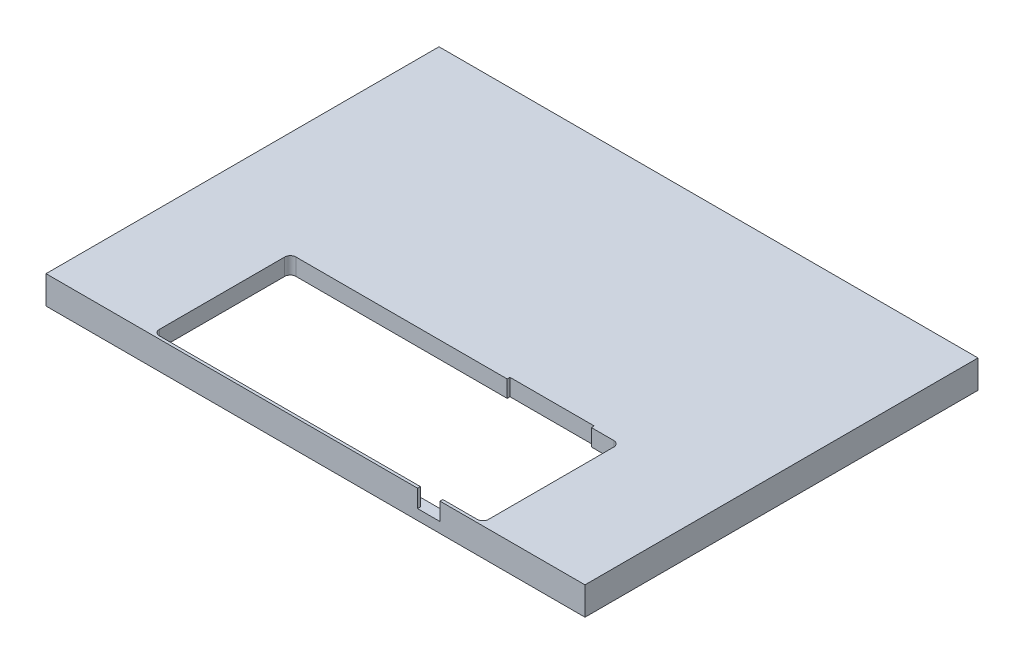
ISO-10303-21;
HEADER;
FILE_DESCRIPTION(('STEP AP214'),'2;1');
FILE_NAME('part.step','',(''),(''),'','','');
FILE_SCHEMA(('AUTOMOTIVE_DESIGN { 1 0 10303 214 1 1 1 1 }'));
ENDSEC;
DATA;
#1=APPLICATION_CONTEXT('core data for automotive mechanical design processes');
#2=APPLICATION_PROTOCOL_DEFINITION('international standard','automotive_design',2000,#1);
#3=PRODUCT_CONTEXT('',#1,'mechanical');
#4=PRODUCT('Part','Part','',(#3));
#5=PRODUCT_RELATED_PRODUCT_CATEGORY('part','',(#4));
#6=PRODUCT_DEFINITION_FORMATION('','',#4);
#7=PRODUCT_DEFINITION_CONTEXT('part definition',#1,'design');
#8=PRODUCT_DEFINITION('design','',#6,#7);
#9=PRODUCT_DEFINITION_SHAPE('','',#8);
#10=(LENGTH_UNIT() NAMED_UNIT(*) SI_UNIT(.MILLI.,.METRE.));
#11=(NAMED_UNIT(*) PLANE_ANGLE_UNIT() SI_UNIT($,.RADIAN.));
#12=(NAMED_UNIT(*) SI_UNIT($,.STERADIAN.) SOLID_ANGLE_UNIT());
#13=UNCERTAINTY_MEASURE_WITH_UNIT(LENGTH_MEASURE(1.E-05),#10,'distance_accuracy_value','');
#14=(GEOMETRIC_REPRESENTATION_CONTEXT(3) GLOBAL_UNCERTAINTY_ASSIGNED_CONTEXT((#13)) GLOBAL_UNIT_ASSIGNED_CONTEXT((#10,
#11,#12)) REPRESENTATION_CONTEXT('',''));
#15=CARTESIAN_POINT('',(0.,0.,0.));
#16=DIRECTION('',(0.,0.,1.));
#17=DIRECTION('',(1.,0.,0.));
#18=AXIS2_PLACEMENT_3D('',#15,#16,#17);
#19=CARTESIAN_POINT('',(5.08,12.7,-5.08));
#20=DIRECTION('',(0.,0.,-1.));
#21=DIRECTION('',(-1.,0.,0.));
#22=AXIS2_PLACEMENT_3D('',#19,#20,#21);
#23=PLANE('',#22);
#24=DIRECTION('',(1.,0.,0.));
#25=VECTOR('',#24,1.);
#26=CARTESIAN_POINT('',(5.08,5.08,-5.08));
#27=LINE('',#26,#25);
#28=CARTESIAN_POINT('',(5.08,5.08,-5.08));
#29=VERTEX_POINT('',#28);
#30=CARTESIAN_POINT('',(47.47,5.08,-5.08));
#31=VERTEX_POINT('',#30);
#32=EDGE_CURVE('E297',#29,#31,#27,.T.);
#33=ORIENTED_EDGE('',*,*,#32,.T.);
#34=DIRECTION('',(0.,-1.,0.));
#35=VECTOR('',#34,1.);
#36=CARTESIAN_POINT('',(47.47,12.7,-5.08));
#37=LINE('',#36,#35);
#38=CARTESIAN_POINT('',(47.47,4.7,-5.08));
#39=VERTEX_POINT('',#38);
#40=EDGE_CURVE('E284',#31,#39,#37,.T.);
#41=ORIENTED_EDGE('',*,*,#40,.T.);
#42=DIRECTION('',(-1.,0.,0.));
#43=VECTOR('',#42,1.);
#44=CARTESIAN_POINT('',(5.08,4.7,-5.08));
#45=LINE('',#44,#43);
#46=CARTESIAN_POINT('',(196.37,4.7,-5.08));
#47=VERTEX_POINT('',#46);
#48=EDGE_CURVE('E287',#47,#39,#45,.T.);
#49=ORIENTED_EDGE('',*,*,#48,.F.);
#50=DIRECTION('',(0.,1.,0.));
#51=VECTOR('',#50,1.);
#52=CARTESIAN_POINT('',(196.37,12.7,-5.08));
#53=LINE('',#52,#51);
#54=CARTESIAN_POINT('',(196.37,5.08,-5.08));
#55=VERTEX_POINT('',#54);
#56=EDGE_CURVE('E281',#47,#55,#53,.T.);
#57=ORIENTED_EDGE('',*,*,#56,.T.);
#58=CARTESIAN_POINT('',(238.76,5.08,-5.08));
#59=VERTEX_POINT('',#58);
#60=EDGE_CURVE('E296',#55,#59,#27,.T.);
#61=ORIENTED_EDGE('',*,*,#60,.T.);
#62=DIRECTION('',(0.,-1.,0.));
#63=VECTOR('',#62,1.);
#64=CARTESIAN_POINT('',(238.76,12.7,-5.08));
#65=LINE('',#64,#63);
#66=CARTESIAN_POINT('',(238.76,0.,-5.08));
#67=VERTEX_POINT('',#66);
#68=EDGE_CURVE('E319',#59,#67,#65,.T.);
#69=ORIENTED_EDGE('',*,*,#68,.T.);
#70=DIRECTION('',(1.,0.,0.));
#71=VECTOR('',#70,1.);
#72=CARTESIAN_POINT('',(5.08,0.,-5.08));
#73=LINE('',#72,#71);
#74=CARTESIAN_POINT('',(5.08,0.,-5.08));
#75=VERTEX_POINT('',#74);
#76=EDGE_CURVE('E306',#75,#67,#73,.T.);
#77=ORIENTED_EDGE('',*,*,#76,.F.);
#78=DIRECTION('',(0.,-1.,0.));
#79=VECTOR('',#78,1.);
#80=CARTESIAN_POINT('',(5.08,12.7,-5.08));
#81=LINE('',#80,#79);
#82=EDGE_CURVE('E321',#29,#75,#81,.T.);
#83=ORIENTED_EDGE('',*,*,#82,.F.);
#84=EDGE_LOOP('',(#33,#41,#49,#57,#61,#69,#77,#83));
#85=FACE_BOUND('',#84,.T.);
#86=ADVANCED_FACE('F33',(#85),#23,.T.);
#87=CARTESIAN_POINT('',(0.,5.08,0.));
#88=DIRECTION('',(0.,1.,0.));
#89=DIRECTION('',(0.,0.,1.));
#90=AXIS2_PLACEMENT_3D('',#87,#88,#89);
#91=PLANE('',#90);
#92=DIRECTION('',(0.,0.,-1.));
#93=VECTOR('',#92,1.);
#94=CARTESIAN_POINT('',(47.47,5.08,0.));
#95=LINE('',#94,#93);
#96=CARTESIAN_POINT('',(47.47,5.08,-60.53));
#97=VERTEX_POINT('',#96);
#98=EDGE_CURVE('E370',#31,#97,#95,.T.);
#99=ORIENTED_EDGE('',*,*,#98,.F.);
#100=ORIENTED_EDGE('',*,*,#32,.F.);
#101=DIRECTION('',(0.,0.,1.));
#102=VECTOR('',#101,1.);
#103=CARTESIAN_POINT('',(5.08,5.08,-172.72));
#104=LINE('',#103,#102);
#105=CARTESIAN_POINT('',(5.08,5.08,-172.72));
#106=VERTEX_POINT('',#105);
#107=EDGE_CURVE('E293',#106,#29,#104,.T.);
#108=ORIENTED_EDGE('',*,*,#107,.F.);
#109=DIRECTION('',(-1.,0.,0.));
#110=VECTOR('',#109,1.);
#111=CARTESIAN_POINT('',(238.76,5.08,-172.72));
#112=LINE('',#111,#110);
#113=CARTESIAN_POINT('',(238.76,5.08,-172.72));
#114=VERTEX_POINT('',#113);
#115=EDGE_CURVE('E290',#114,#106,#112,.T.);
#116=ORIENTED_EDGE('',*,*,#115,.F.);
#117=DIRECTION('',(0.,0.,-1.));
#118=VECTOR('',#117,1.);
#119=CARTESIAN_POINT('',(238.76,5.08,-5.08));
#120=LINE('',#119,#118);
#121=EDGE_CURVE('E300',#59,#114,#120,.T.);
#122=ORIENTED_EDGE('',*,*,#121,.F.);
#123=ORIENTED_EDGE('',*,*,#60,.F.);
#124=DIRECTION('',(0.,0.,1.));
#125=VECTOR('',#124,1.);
#126=CARTESIAN_POINT('',(196.37,5.08,0.));
#127=LINE('',#126,#125);
#128=CARTESIAN_POINT('',(196.37,5.08,-60.53));
#129=VERTEX_POINT('',#128);
#130=EDGE_CURVE('E355',#129,#55,#127,.T.);
#131=ORIENTED_EDGE('',*,*,#130,.F.);
#132=CARTESIAN_POINT('',(193.83,5.08,-60.53));
#133=DIRECTION('',(0.,1.,0.));
#134=DIRECTION('',(0.,0.,1.));
#135=AXIS2_PLACEMENT_3D('',#132,#133,#134);
#136=CIRCLE('',#135,2.54);
#137=CARTESIAN_POINT('',(193.83,5.08,-63.07));
#138=VERTEX_POINT('',#137);
#139=EDGE_CURVE('E11',#129,#138,#136,.T.);
#140=ORIENTED_EDGE('',*,*,#139,.T.);
#141=DIRECTION('',(-1.,0.,0.));
#142=VECTOR('',#141,1.);
#143=CARTESIAN_POINT('',(-1.37838122368323E-13,5.08,-63.0699999999996));
#144=LINE('',#143,#142);
#145=CARTESIAN_POINT('',(183.67,5.08,-63.07));
#146=VERTEX_POINT('',#145);
#147=EDGE_CURVE('E357',#138,#146,#144,.T.);
#148=ORIENTED_EDGE('',*,*,#147,.T.);
#149=DIRECTION('',(0.,0.,-1.));
#150=VECTOR('',#149,1.);
#151=CARTESIAN_POINT('',(183.67,5.08,0.));
#152=LINE('',#151,#150);
#153=CARTESIAN_POINT('',(183.67,5.08,-64.34));
#154=VERTEX_POINT('',#153);
#155=EDGE_CURVE('E359',#146,#154,#152,.T.);
#156=ORIENTED_EDGE('',*,*,#155,.T.);
#157=DIRECTION('',(-1.,0.,0.));
#158=VECTOR('',#157,1.);
#159=CARTESIAN_POINT('',(0.,5.08,-64.3399999999999));
#160=LINE('',#159,#158);
#161=CARTESIAN_POINT('',(145.57,5.08,-64.34));
#162=VERTEX_POINT('',#161);
#163=EDGE_CURVE('E362',#154,#162,#160,.T.);
#164=ORIENTED_EDGE('',*,*,#163,.T.);
#165=DIRECTION('',(0.,0.,-1.));
#166=VECTOR('',#165,1.);
#167=CARTESIAN_POINT('',(145.57,5.08,0.));
#168=LINE('',#167,#166);
#169=CARTESIAN_POINT('',(145.57,5.08,-63.07));
#170=VERTEX_POINT('',#169);
#171=EDGE_CURVE('E365',#170,#162,#168,.T.);
#172=ORIENTED_EDGE('',*,*,#171,.F.);
#173=DIRECTION('',(-1.,0.,0.));
#174=VECTOR('',#173,1.);
#175=CARTESIAN_POINT('',(0.,5.08,-63.07));
#176=LINE('',#175,#174);
#177=CARTESIAN_POINT('',(50.01,5.08,-63.07));
#178=VERTEX_POINT('',#177);
#179=EDGE_CURVE('E367',#170,#178,#176,.T.);
#180=ORIENTED_EDGE('',*,*,#179,.T.);
#181=CARTESIAN_POINT('',(50.01,5.08,-60.53));
#182=DIRECTION('',(0.,1.,0.));
#183=DIRECTION('',(0.,0.,1.));
#184=AXIS2_PLACEMENT_3D('',#181,#182,#183);
#185=CIRCLE('',#184,2.54);
#186=EDGE_CURVE('E397',#178,#97,#185,.T.);
#187=ORIENTED_EDGE('',*,*,#186,.T.);
#188=EDGE_LOOP('',(#99,#100,#108,#116,#122,#123,#131,#140,#148,#156,#164,#172,#180,#187));
#189=FACE_BOUND('',#188,.T.);
#190=ADVANCED_FACE('F416',(#189),#91,.F.);
#191=CARTESIAN_POINT('',(5.08,12.7,-5.08));
#192=DIRECTION('',(1.,0.,0.));
#193=DIRECTION('',(0.,0.,-1.));
#194=AXIS2_PLACEMENT_3D('',#191,#192,#193);
#195=PLANE('',#194);
#196=DIRECTION('',(0.,-1.,0.));
#197=VECTOR('',#196,1.);
#198=CARTESIAN_POINT('',(5.08,12.7,-172.72));
#199=LINE('',#198,#197);
#200=CARTESIAN_POINT('',(5.08,0.,-172.72));
#201=VERTEX_POINT('',#200);
#202=EDGE_CURVE('E315',#106,#201,#199,.T.);
#203=ORIENTED_EDGE('',*,*,#202,.F.);
#204=ORIENTED_EDGE('',*,*,#107,.T.);
#205=ORIENTED_EDGE('',*,*,#82,.T.);
#206=DIRECTION('',(0.,0.,1.));
#207=VECTOR('',#206,1.);
#208=CARTESIAN_POINT('',(5.08,0.,-5.08));
#209=LINE('',#208,#207);
#210=EDGE_CURVE('E303',#201,#75,#209,.T.);
#211=ORIENTED_EDGE('',*,*,#210,.F.);
#212=EDGE_LOOP('',(#203,#204,#205,#211));
#213=FACE_BOUND('',#212,.T.);
#214=ADVANCED_FACE('F447',(#213),#195,.T.);
#215=CARTESIAN_POINT('',(238.76,12.7,-5.08));
#216=DIRECTION('',(-1.,0.,0.));
#217=DIRECTION('',(0.,0.,1.));
#218=AXIS2_PLACEMENT_3D('',#215,#216,#217);
#219=PLANE('',#218);
#220=ORIENTED_EDGE('',*,*,#68,.F.);
#221=ORIENTED_EDGE('',*,*,#121,.T.);
#222=DIRECTION('',(0.,-1.,0.));
#223=VECTOR('',#222,1.);
#224=CARTESIAN_POINT('',(238.76,12.7,-172.72));
#225=LINE('',#224,#223);
#226=CARTESIAN_POINT('',(238.76,0.,-172.72));
#227=VERTEX_POINT('',#226);
#228=EDGE_CURVE('E317',#114,#227,#225,.T.);
#229=ORIENTED_EDGE('',*,*,#228,.T.);
#230=DIRECTION('',(0.,0.,-1.));
#231=VECTOR('',#230,1.);
#232=CARTESIAN_POINT('',(238.76,0.,-5.08));
#233=LINE('',#232,#231);
#234=EDGE_CURVE('E309',#67,#227,#233,.T.);
#235=ORIENTED_EDGE('',*,*,#234,.F.);
#236=EDGE_LOOP('',(#220,#221,#229,#235));
#237=FACE_BOUND('',#236,.T.);
#238=ADVANCED_FACE('F457',(#237),#219,.T.);
#239=CARTESIAN_POINT('',(5.08,12.7,-172.72));
#240=DIRECTION('',(0.,0.,1.));
#241=DIRECTION('',(1.,0.,0.));
#242=AXIS2_PLACEMENT_3D('',#239,#240,#241);
#243=PLANE('',#242);
#244=ORIENTED_EDGE('',*,*,#228,.F.);
#245=ORIENTED_EDGE('',*,*,#115,.T.);
#246=ORIENTED_EDGE('',*,*,#202,.T.);
#247=DIRECTION('',(-1.,0.,0.));
#248=VECTOR('',#247,1.);
#249=CARTESIAN_POINT('',(5.08,0.,-172.72));
#250=LINE('',#249,#248);
#251=EDGE_CURVE('E312',#227,#201,#250,.T.);
#252=ORIENTED_EDGE('',*,*,#251,.F.);
#253=EDGE_LOOP('',(#244,#245,#246,#252));
#254=FACE_BOUND('',#253,.T.);
#255=ADVANCED_FACE('F452',(#254),#243,.T.);
#256=CARTESIAN_POINT('',(0.,12.7,0.));
#257=DIRECTION('',(0.,-1.,0.));
#258=DIRECTION('',(0.,0.,-1.));
#259=AXIS2_PLACEMENT_3D('',#256,#257,#258);
#260=PLANE('',#259);
#261=DIRECTION('',(0.,0.,1.));
#262=VECTOR('',#261,1.);
#263=CARTESIAN_POINT('',(196.37,12.7,-63.07));
#264=LINE('',#263,#262);
#265=CARTESIAN_POINT('',(196.37,12.7,-60.53));
#266=VERTEX_POINT('',#265);
#267=CARTESIAN_POINT('',(196.37,12.7,-3.81));
#268=VERTEX_POINT('',#267);
#269=EDGE_CURVE('E256',#266,#268,#264,.T.);
#270=ORIENTED_EDGE('',*,*,#269,.T.);
#271=CARTESIAN_POINT('',(193.83,12.7,-3.81));
#272=DIRECTION('',(0.,-1.,0.));
#273=DIRECTION('',(0.,0.,-1.));
#274=AXIS2_PLACEMENT_3D('',#271,#272,#273);
#275=CIRCLE('',#274,2.54);
#276=CARTESIAN_POINT('',(193.83,12.7,-1.27));
#277=VERTEX_POINT('',#276);
#278=EDGE_CURVE('E401',#268,#277,#275,.T.);
#279=ORIENTED_EDGE('',*,*,#278,.T.);
#280=DIRECTION('',(-1.,0.,0.));
#281=VECTOR('',#280,1.);
#282=CARTESIAN_POINT('',(196.37,12.7,-1.27));
#283=LINE('',#282,#281);
#284=CARTESIAN_POINT('',(178.258137898671,12.7,-1.27));
#285=VERTEX_POINT('',#284);
#286=EDGE_CURVE('E259',#277,#285,#283,.T.);
#287=ORIENTED_EDGE('',*,*,#286,.T.);
#288=DIRECTION('',(0.,0.,-1.));
#289=VECTOR('',#288,1.);
#290=CARTESIAN_POINT('',(178.258137898671,12.7,0.));
#291=LINE('',#290,#289);
#292=CARTESIAN_POINT('',(178.258137898671,12.7,0.));
#293=VERTEX_POINT('',#292);
#294=EDGE_CURVE('E223',#293,#285,#291,.T.);
#295=ORIENTED_EDGE('',*,*,#294,.F.);
#296=DIRECTION('',(1.,0.,0.));
#297=VECTOR('',#296,1.);
#298=CARTESIAN_POINT('',(0.,12.7,0.));
#299=LINE('',#298,#297);
#300=CARTESIAN_POINT('',(243.84,12.7,0.));
#301=VERTEX_POINT('',#300);
#302=EDGE_CURVE('E327',#293,#301,#299,.T.);
#303=ORIENTED_EDGE('',*,*,#302,.T.);
#304=DIRECTION('',(0.,0.,-1.));
#305=VECTOR('',#304,1.);
#306=CARTESIAN_POINT('',(243.84,12.7,0.));
#307=LINE('',#306,#305);
#308=CARTESIAN_POINT('',(243.84,12.7,-177.8));
#309=VERTEX_POINT('',#308);
#310=EDGE_CURVE('E332',#301,#309,#307,.T.);
#311=ORIENTED_EDGE('',*,*,#310,.T.);
#312=DIRECTION('',(-1.,0.,0.));
#313=VECTOR('',#312,1.);
#314=CARTESIAN_POINT('',(0.,12.7,-177.8));
#315=LINE('',#314,#313);
#316=CARTESIAN_POINT('',(0.,12.7,-177.8));
#317=VERTEX_POINT('',#316);
#318=EDGE_CURVE('E334',#309,#317,#315,.T.);
#319=ORIENTED_EDGE('',*,*,#318,.T.);
#320=DIRECTION('',(0.,0.,1.));
#321=VECTOR('',#320,1.);
#322=CARTESIAN_POINT('',(0.,12.7,0.));
#323=LINE('',#322,#321);
#324=CARTESIAN_POINT('',(0.,12.7,0.));
#325=VERTEX_POINT('',#324);
#326=EDGE_CURVE('E324',#317,#325,#323,.T.);
#327=ORIENTED_EDGE('',*,*,#326,.T.);
#328=CARTESIAN_POINT('',(168.098137898671,12.7,0.));
#329=VERTEX_POINT('',#328);
#330=EDGE_CURVE('E329',#325,#329,#299,.T.);
#331=ORIENTED_EDGE('',*,*,#330,.T.);
#332=DIRECTION('',(0.,0.,1.));
#333=VECTOR('',#332,1.);
#334=CARTESIAN_POINT('',(168.098137898671,12.7,-1.27));
#335=LINE('',#334,#333);
#336=CARTESIAN_POINT('',(168.098137898671,12.7,-1.27));
#337=VERTEX_POINT('',#336);
#338=EDGE_CURVE('E262',#337,#329,#335,.T.);
#339=ORIENTED_EDGE('',*,*,#338,.F.);
#340=DIRECTION('',(1.,0.,0.));
#341=VECTOR('',#340,1.);
#342=CARTESIAN_POINT('',(157.995367115626,12.7,-1.27));
#343=LINE('',#342,#341);
#344=CARTESIAN_POINT('',(50.01,12.7,-1.27));
#345=VERTEX_POINT('',#344);
#346=EDGE_CURVE('E264',#345,#337,#343,.T.);
#347=ORIENTED_EDGE('',*,*,#346,.F.);
#348=CARTESIAN_POINT('',(50.01,12.7,-3.81));
#349=DIRECTION('',(0.,-1.,0.));
#350=DIRECTION('',(0.,0.,-1.));
#351=AXIS2_PLACEMENT_3D('',#348,#349,#350);
#352=CIRCLE('',#351,2.54);
#353=CARTESIAN_POINT('',(47.47,12.7,-3.81));
#354=VERTEX_POINT('',#353);
#355=EDGE_CURVE('E399',#345,#354,#352,.T.);
#356=ORIENTED_EDGE('',*,*,#355,.T.);
#357=DIRECTION('',(0.,0.,-1.));
#358=VECTOR('',#357,1.);
#359=CARTESIAN_POINT('',(47.47,12.7,-1.27));
#360=LINE('',#359,#358);
#361=CARTESIAN_POINT('',(47.47,12.7,-60.53));
#362=VERTEX_POINT('',#361);
#363=EDGE_CURVE('E239',#354,#362,#360,.T.);
#364=ORIENTED_EDGE('',*,*,#363,.T.);
#365=CARTESIAN_POINT('',(50.01,12.7,-60.53));
#366=DIRECTION('',(0.,-1.,0.));
#367=DIRECTION('',(0.,0.,-1.));
#368=AXIS2_PLACEMENT_3D('',#365,#366,#367);
#369=CIRCLE('',#368,2.54);
#370=CARTESIAN_POINT('',(50.01,12.7,-63.07));
#371=VERTEX_POINT('',#370);
#372=EDGE_CURVE('E395',#362,#371,#369,.T.);
#373=ORIENTED_EDGE('',*,*,#372,.T.);
#374=DIRECTION('',(-1.,0.,0.));
#375=VECTOR('',#374,1.);
#376=CARTESIAN_POINT('',(145.57,12.7,-63.07));
#377=LINE('',#376,#375);
#378=CARTESIAN_POINT('',(145.57,12.7,-63.07));
#379=VERTEX_POINT('',#378);
#380=EDGE_CURVE('E242',#379,#371,#377,.T.);
#381=ORIENTED_EDGE('',*,*,#380,.F.);
#382=DIRECTION('',(0.,0.,-1.));
#383=VECTOR('',#382,1.);
#384=CARTESIAN_POINT('',(145.57,12.7,-63.07));
#385=LINE('',#384,#383);
#386=CARTESIAN_POINT('',(145.57,12.7,-64.34));
#387=VERTEX_POINT('',#386);
#388=EDGE_CURVE('E245',#379,#387,#385,.T.);
#389=ORIENTED_EDGE('',*,*,#388,.T.);
#390=DIRECTION('',(-1.,0.,0.));
#391=VECTOR('',#390,1.);
#392=CARTESIAN_POINT('',(183.67,12.7,-64.34));
#393=LINE('',#392,#391);
#394=CARTESIAN_POINT('',(183.67,12.7,-64.34));
#395=VERTEX_POINT('',#394);
#396=EDGE_CURVE('E248',#395,#387,#393,.T.);
#397=ORIENTED_EDGE('',*,*,#396,.F.);
#398=DIRECTION('',(0.,0.,-1.));
#399=VECTOR('',#398,1.);
#400=CARTESIAN_POINT('',(183.67,12.7,-63.07));
#401=LINE('',#400,#399);
#402=CARTESIAN_POINT('',(183.67,12.7,-63.07));
#403=VERTEX_POINT('',#402);
#404=EDGE_CURVE('E251',#403,#395,#401,.T.);
#405=ORIENTED_EDGE('',*,*,#404,.F.);
#406=DIRECTION('',(-1.,0.,0.));
#407=VECTOR('',#406,1.);
#408=CARTESIAN_POINT('',(196.37,12.7,-63.07));
#409=LINE('',#408,#407);
#410=CARTESIAN_POINT('',(193.83,12.7,-63.07));
#411=VERTEX_POINT('',#410);
#412=EDGE_CURVE('E254',#411,#403,#409,.T.);
#413=ORIENTED_EDGE('',*,*,#412,.F.);
#414=CARTESIAN_POINT('',(193.83,12.7,-60.53));
#415=DIRECTION('',(0.,-1.,0.));
#416=DIRECTION('',(0.,0.,-1.));
#417=AXIS2_PLACEMENT_3D('',#414,#415,#416);
#418=CIRCLE('',#417,2.54);
#419=EDGE_CURVE('E41',#411,#266,#418,.T.);
#420=ORIENTED_EDGE('',*,*,#419,.T.);
#421=EDGE_LOOP('',(#270,#279,#287,#295,#303,#311,#319,#327,#331,#339,#347,#356,#364,#373,#381,
#389,#397,#405,#413,#420));
#422=FACE_BOUND('',#421,.T.);
#423=ADVANCED_FACE('F405',(#422),#260,.F.);
#424=CARTESIAN_POINT('',(0.,0.,0.));
#425=DIRECTION('',(0.,-1.,0.));
#426=DIRECTION('',(0.,0.,-1.));
#427=AXIS2_PLACEMENT_3D('',#424,#425,#426);
#428=PLANE('',#427);
#429=DIRECTION('',(0.,0.,1.));
#430=VECTOR('',#429,1.);
#431=CARTESIAN_POINT('',(0.,0.,0.));
#432=LINE('',#431,#430);
#433=CARTESIAN_POINT('',(0.,0.,-177.8));
#434=VERTEX_POINT('',#433);
#435=CARTESIAN_POINT('',(0.,0.,0.));
#436=VERTEX_POINT('',#435);
#437=EDGE_CURVE('E323',#434,#436,#432,.T.);
#438=ORIENTED_EDGE('',*,*,#437,.F.);
#439=DIRECTION('',(-1.,0.,0.));
#440=VECTOR('',#439,1.);
#441=CARTESIAN_POINT('',(0.,0.,-177.8));
#442=LINE('',#441,#440);
#443=CARTESIAN_POINT('',(243.84,0.,-177.8));
#444=VERTEX_POINT('',#443);
#445=EDGE_CURVE('E328',#444,#434,#442,.T.);
#446=ORIENTED_EDGE('',*,*,#445,.F.);
#447=DIRECTION('',(0.,0.,-1.));
#448=VECTOR('',#447,1.);
#449=CARTESIAN_POINT('',(243.84,0.,0.));
#450=LINE('',#449,#448);
#451=CARTESIAN_POINT('',(243.84,0.,0.));
#452=VERTEX_POINT('',#451);
#453=EDGE_CURVE('E341',#452,#444,#450,.T.);
#454=ORIENTED_EDGE('',*,*,#453,.F.);
#455=DIRECTION('',(1.,0.,0.));
#456=VECTOR('',#455,1.);
#457=CARTESIAN_POINT('',(0.,0.,0.));
#458=LINE('',#457,#456);
#459=EDGE_CURVE('E339',#436,#452,#458,.T.);
#460=ORIENTED_EDGE('',*,*,#459,.F.);
#461=EDGE_LOOP('',(#438,#446,#454,#460));
#462=FACE_BOUND('',#461,.T.);
#463=ORIENTED_EDGE('',*,*,#251,.T.);
#464=ORIENTED_EDGE('',*,*,#210,.T.);
#465=ORIENTED_EDGE('',*,*,#76,.T.);
#466=ORIENTED_EDGE('',*,*,#234,.T.);
#467=EDGE_LOOP('',(#463,#464,#465,#466));
#468=FACE_BOUND('',#467,.T.);
#469=ADVANCED_FACE('F502',(#462,#468),#428,.T.);
#470=CARTESIAN_POINT('',(0.,12.7,0.));
#471=DIRECTION('',(1.,0.,0.));
#472=DIRECTION('',(0.,0.,-1.));
#473=AXIS2_PLACEMENT_3D('',#470,#471,#472);
#474=PLANE('',#473);
#475=ORIENTED_EDGE('',*,*,#437,.T.);
#476=DIRECTION('',(0.,-1.,0.));
#477=VECTOR('',#476,1.);
#478=CARTESIAN_POINT('',(0.,12.7,0.));
#479=LINE('',#478,#477);
#480=EDGE_CURVE('E352',#325,#436,#479,.T.);
#481=ORIENTED_EDGE('',*,*,#480,.F.);
#482=ORIENTED_EDGE('',*,*,#326,.F.);
#483=DIRECTION('',(0.,-1.,0.));
#484=VECTOR('',#483,1.);
#485=CARTESIAN_POINT('',(0.,12.7,-177.8));
#486=LINE('',#485,#484);
#487=EDGE_CURVE('E336',#317,#434,#486,.T.);
#488=ORIENTED_EDGE('',*,*,#487,.T.);
#489=EDGE_LOOP('',(#475,#481,#482,#488));
#490=FACE_BOUND('',#489,.T.);
#491=ADVANCED_FACE('F505',(#490),#474,.F.);
#492=CARTESIAN_POINT('',(0.,12.7,0.));
#493=DIRECTION('',(0.,0.,-1.));
#494=DIRECTION('',(-1.,0.,0.));
#495=AXIS2_PLACEMENT_3D('',#492,#493,#494);
#496=PLANE('',#495);
#497=ORIENTED_EDGE('',*,*,#302,.F.);
#498=DIRECTION('',(0.,1.,0.));
#499=VECTOR('',#498,1.);
#500=CARTESIAN_POINT('',(178.258137898671,4.7,0.));
#501=LINE('',#500,#499);
#502=CARTESIAN_POINT('',(178.258137898671,4.7,0.));
#503=VERTEX_POINT('',#502);
#504=EDGE_CURVE('E225',#503,#293,#501,.T.);
#505=ORIENTED_EDGE('',*,*,#504,.F.);
#506=DIRECTION('',(1.,0.,0.));
#507=VECTOR('',#506,1.);
#508=CARTESIAN_POINT('',(168.098137898671,4.7,0.));
#509=LINE('',#508,#507);
#510=CARTESIAN_POINT('',(168.098137898671,4.7,0.));
#511=VERTEX_POINT('',#510);
#512=EDGE_CURVE('E230',#511,#503,#509,.T.);
#513=ORIENTED_EDGE('',*,*,#512,.F.);
#514=DIRECTION('',(0.,1.,0.));
#515=VECTOR('',#514,1.);
#516=CARTESIAN_POINT('',(168.098137898671,4.7,0.));
#517=LINE('',#516,#515);
#518=EDGE_CURVE('E269',#511,#329,#517,.T.);
#519=ORIENTED_EDGE('',*,*,#518,.T.);
#520=ORIENTED_EDGE('',*,*,#330,.F.);
#521=ORIENTED_EDGE('',*,*,#480,.T.);
#522=ORIENTED_EDGE('',*,*,#459,.T.);
#523=DIRECTION('',(0.,-1.,0.));
#524=VECTOR('',#523,1.);
#525=CARTESIAN_POINT('',(243.84,12.7,0.));
#526=LINE('',#525,#524);
#527=EDGE_CURVE('E349',#301,#452,#526,.T.);
#528=ORIENTED_EDGE('',*,*,#527,.F.);
#529=EDGE_LOOP('',(#497,#505,#513,#519,#520,#521,#522,#528));
#530=FACE_BOUND('',#529,.T.);
#531=ADVANCED_FACE('F479',(#530),#496,.F.);
#532=CARTESIAN_POINT('',(243.84,12.7,0.));
#533=DIRECTION('',(-1.,0.,0.));
#534=DIRECTION('',(0.,0.,1.));
#535=AXIS2_PLACEMENT_3D('',#532,#533,#534);
#536=PLANE('',#535);
#537=ORIENTED_EDGE('',*,*,#453,.T.);
#538=DIRECTION('',(0.,-1.,0.));
#539=VECTOR('',#538,1.);
#540=CARTESIAN_POINT('',(243.84,12.7,-177.8));
#541=LINE('',#540,#539);
#542=EDGE_CURVE('E346',#309,#444,#541,.T.);
#543=ORIENTED_EDGE('',*,*,#542,.F.);
#544=ORIENTED_EDGE('',*,*,#310,.F.);
#545=ORIENTED_EDGE('',*,*,#527,.T.);
#546=EDGE_LOOP('',(#537,#543,#544,#545));
#547=FACE_BOUND('',#546,.T.);
#548=ADVANCED_FACE('F510',(#547),#536,.F.);
#549=CARTESIAN_POINT('',(0.,12.7,-177.8));
#550=DIRECTION('',(0.,0.,1.));
#551=DIRECTION('',(1.,0.,0.));
#552=AXIS2_PLACEMENT_3D('',#549,#550,#551);
#553=PLANE('',#552);
#554=ORIENTED_EDGE('',*,*,#445,.T.);
#555=ORIENTED_EDGE('',*,*,#487,.F.);
#556=ORIENTED_EDGE('',*,*,#318,.F.);
#557=ORIENTED_EDGE('',*,*,#542,.T.);
#558=EDGE_LOOP('',(#554,#555,#556,#557));
#559=FACE_BOUND('',#558,.T.);
#560=ADVANCED_FACE('F507',(#559),#553,.F.);
#561=CARTESIAN_POINT('',(145.57,4.7,-63.07));
#562=DIRECTION('',(0.,0.,-1.));
#563=DIRECTION('',(-1.,0.,0.));
#564=AXIS2_PLACEMENT_3D('',#561,#562,#563);
#565=PLANE('',#564);
#566=ORIENTED_EDGE('',*,*,#380,.T.);
#567=DIRECTION('',(0.,1.,0.));
#568=VECTOR('',#567,1.);
#569=CARTESIAN_POINT('',(50.01,4.7,-63.07));
#570=LINE('',#569,#568);
#571=EDGE_CURVE('E378',#371,#178,#570,.F.);
#572=ORIENTED_EDGE('',*,*,#571,.T.);
#573=ORIENTED_EDGE('',*,*,#179,.F.);
#574=DIRECTION('',(0.,1.,0.));
#575=VECTOR('',#574,1.);
#576=CARTESIAN_POINT('',(145.57,4.7,-63.07));
#577=LINE('',#576,#575);
#578=EDGE_CURVE('E279',#170,#379,#577,.T.);
#579=ORIENTED_EDGE('',*,*,#578,.T.);
#580=EDGE_LOOP('',(#566,#572,#573,#579));
#581=FACE_BOUND('',#580,.T.);
#582=ADVANCED_FACE('F432',(#581),#565,.F.);
#583=CARTESIAN_POINT('',(145.57,4.7,-63.07));
#584=DIRECTION('',(1.,0.,0.));
#585=DIRECTION('',(0.,0.,-1.));
#586=AXIS2_PLACEMENT_3D('',#583,#584,#585);
#587=PLANE('',#586);
#588=ORIENTED_EDGE('',*,*,#171,.T.);
#589=DIRECTION('',(0.,1.,0.));
#590=VECTOR('',#589,1.);
#591=CARTESIAN_POINT('',(145.57,4.7,-64.34));
#592=LINE('',#591,#590);
#593=EDGE_CURVE('E277',#162,#387,#592,.T.);
#594=ORIENTED_EDGE('',*,*,#593,.T.);
#595=ORIENTED_EDGE('',*,*,#388,.F.);
#596=ORIENTED_EDGE('',*,*,#578,.F.);
#597=EDGE_LOOP('',(#588,#594,#595,#596));
#598=FACE_BOUND('',#597,.T.);
#599=ADVANCED_FACE('F428',(#598),#587,.T.);
#600=CARTESIAN_POINT('',(183.67,4.7,-64.34));
#601=DIRECTION('',(0.,0.,-1.));
#602=DIRECTION('',(-1.,0.,0.));
#603=AXIS2_PLACEMENT_3D('',#600,#601,#602);
#604=PLANE('',#603);
#605=DIRECTION('',(0.,1.,0.));
#606=VECTOR('',#605,1.);
#607=CARTESIAN_POINT('',(183.67,4.7,-64.34));
#608=LINE('',#607,#606);
#609=EDGE_CURVE('E275',#154,#395,#608,.T.);
#610=ORIENTED_EDGE('',*,*,#609,.T.);
#611=ORIENTED_EDGE('',*,*,#396,.T.);
#612=ORIENTED_EDGE('',*,*,#593,.F.);
#613=ORIENTED_EDGE('',*,*,#163,.F.);
#614=EDGE_LOOP('',(#610,#611,#612,#613));
#615=FACE_BOUND('',#614,.T.);
#616=ADVANCED_FACE('F422',(#615),#604,.F.);
#617=CARTESIAN_POINT('',(183.67,4.7,-63.07));
#618=DIRECTION('',(1.,0.,0.));
#619=DIRECTION('',(0.,0.,-1.));
#620=AXIS2_PLACEMENT_3D('',#617,#618,#619);
#621=PLANE('',#620);
#622=DIRECTION('',(0.,1.,0.));
#623=VECTOR('',#622,1.);
#624=CARTESIAN_POINT('',(183.67,4.7,-63.07));
#625=LINE('',#624,#623);
#626=EDGE_CURVE('E224',#146,#403,#625,.T.);
#627=ORIENTED_EDGE('',*,*,#626,.T.);
#628=ORIENTED_EDGE('',*,*,#404,.T.);
#629=ORIENTED_EDGE('',*,*,#609,.F.);
#630=ORIENTED_EDGE('',*,*,#155,.F.);
#631=EDGE_LOOP('',(#627,#628,#629,#630));
#632=FACE_BOUND('',#631,.T.);
#633=ADVANCED_FACE('F419',(#632),#621,.F.);
#634=CARTESIAN_POINT('',(196.37,4.7,-63.07));
#635=DIRECTION('',(0.,0.,-1.));
#636=DIRECTION('',(-1.,0.,0.));
#637=AXIS2_PLACEMENT_3D('',#634,#635,#636);
#638=PLANE('',#637);
#639=ORIENTED_EDGE('',*,*,#147,.F.);
#640=DIRECTION('',(0.,1.,0.));
#641=VECTOR('',#640,1.);
#642=CARTESIAN_POINT('',(193.83,4.7,-63.07));
#643=LINE('',#642,#641);
#644=EDGE_CURVE('E393',#138,#411,#643,.T.);
#645=ORIENTED_EDGE('',*,*,#644,.T.);
#646=ORIENTED_EDGE('',*,*,#412,.T.);
#647=ORIENTED_EDGE('',*,*,#626,.F.);
#648=EDGE_LOOP('',(#639,#645,#646,#647));
#649=FACE_BOUND('',#648,.T.);
#650=ADVANCED_FACE('F412',(#649),#638,.F.);
#651=CARTESIAN_POINT('',(47.47,4.7,-1.27));
#652=DIRECTION('',(1.,0.,0.));
#653=DIRECTION('',(0.,0.,-1.));
#654=AXIS2_PLACEMENT_3D('',#651,#652,#653);
#655=PLANE('',#654);
#656=ORIENTED_EDGE('',*,*,#98,.T.);
#657=DIRECTION('',(0.,1.,0.));
#658=VECTOR('',#657,1.);
#659=CARTESIAN_POINT('',(47.47,4.7,-60.53));
#660=LINE('',#659,#658);
#661=EDGE_CURVE('E375',#97,#362,#660,.T.);
#662=ORIENTED_EDGE('',*,*,#661,.T.);
#663=ORIENTED_EDGE('',*,*,#363,.F.);
#664=DIRECTION('',(0.,1.,0.));
#665=VECTOR('',#664,1.);
#666=CARTESIAN_POINT('',(47.47,4.7,-3.81));
#667=LINE('',#666,#665);
#668=CARTESIAN_POINT('',(47.47,4.7,-3.81));
#669=VERTEX_POINT('',#668);
#670=EDGE_CURVE('E373',#354,#669,#667,.F.);
#671=ORIENTED_EDGE('',*,*,#670,.T.);
#672=DIRECTION('',(0.,0.,-1.));
#673=VECTOR('',#672,1.);
#674=CARTESIAN_POINT('',(47.47,4.7,-1.27));
#675=LINE('',#674,#673);
#676=EDGE_CURVE('E440',#669,#39,#675,.T.);
#677=ORIENTED_EDGE('',*,*,#676,.T.);
#678=ORIENTED_EDGE('',*,*,#40,.F.);
#679=EDGE_LOOP('',(#656,#662,#663,#671,#677,#678));
#680=FACE_BOUND('',#679,.T.);
#681=ADVANCED_FACE('F438',(#680),#655,.T.);
#682=CARTESIAN_POINT('',(196.37,4.7,-63.07));
#683=DIRECTION('',(-1.,0.,0.));
#684=DIRECTION('',(0.,0.,1.));
#685=AXIS2_PLACEMENT_3D('',#682,#683,#684);
#686=PLANE('',#685);
#687=DIRECTION('',(0.,0.,1.));
#688=VECTOR('',#687,1.);
#689=CARTESIAN_POINT('',(196.37,4.7,-63.07));
#690=LINE('',#689,#688);
#691=CARTESIAN_POINT('',(196.37,4.7,-3.81));
#692=VERTEX_POINT('',#691);
#693=EDGE_CURVE('E217',#47,#692,#690,.T.);
#694=ORIENTED_EDGE('',*,*,#693,.T.);
#695=DIRECTION('',(0.,1.,0.));
#696=VECTOR('',#695,1.);
#697=CARTESIAN_POINT('',(196.37,12.7,-3.81));
#698=LINE('',#697,#696);
#699=EDGE_CURVE('E389',#692,#268,#698,.T.);
#700=ORIENTED_EDGE('',*,*,#699,.T.);
#701=ORIENTED_EDGE('',*,*,#269,.F.);
#702=DIRECTION('',(0.,1.,0.));
#703=VECTOR('',#702,1.);
#704=CARTESIAN_POINT('',(196.37,4.7,-60.53));
#705=LINE('',#704,#703);
#706=EDGE_CURVE('E387',#266,#129,#705,.F.);
#707=ORIENTED_EDGE('',*,*,#706,.T.);
#708=ORIENTED_EDGE('',*,*,#130,.T.);
#709=ORIENTED_EDGE('',*,*,#56,.F.);
#710=EDGE_LOOP('',(#694,#700,#701,#707,#708,#709));
#711=FACE_BOUND('',#710,.T.);
#712=ADVANCED_FACE('F409',(#711),#686,.T.);
#713=CARTESIAN_POINT('',(196.37,4.7,-1.27));
#714=DIRECTION('',(0.,0.,-1.));
#715=DIRECTION('',(-1.,0.,0.));
#716=AXIS2_PLACEMENT_3D('',#713,#714,#715);
#717=PLANE('',#716);
#718=ORIENTED_EDGE('',*,*,#286,.F.);
#719=DIRECTION('',(0.,1.,0.));
#720=VECTOR('',#719,1.);
#721=CARTESIAN_POINT('',(193.83,4.7,-1.27));
#722=LINE('',#721,#720);
#723=CARTESIAN_POINT('',(193.83,4.7,-1.27));
#724=VERTEX_POINT('',#723);
#725=EDGE_CURVE('E212',#277,#724,#722,.F.);
#726=ORIENTED_EDGE('',*,*,#725,.T.);
#727=DIRECTION('',(-1.,0.,0.));
#728=VECTOR('',#727,1.);
#729=CARTESIAN_POINT('',(196.37,4.7,-1.27));
#730=LINE('',#729,#728);
#731=CARTESIAN_POINT('',(178.258137898671,4.7,-1.27));
#732=VERTEX_POINT('',#731);
#733=EDGE_CURVE('E205',#724,#732,#730,.T.);
#734=ORIENTED_EDGE('',*,*,#733,.T.);
#735=DIRECTION('',(0.,1.,0.));
#736=VECTOR('',#735,1.);
#737=CARTESIAN_POINT('',(178.258137898671,4.7,-1.27));
#738=LINE('',#737,#736);
#739=EDGE_CURVE('E209',#732,#285,#738,.T.);
#740=ORIENTED_EDGE('',*,*,#739,.T.);
#741=EDGE_LOOP('',(#718,#726,#734,#740));
#742=FACE_BOUND('',#741,.T.);
#743=ADVANCED_FACE('F208',(#742),#717,.T.);
#744=CARTESIAN_POINT('',(178.258137898671,4.7,0.));
#745=DIRECTION('',(1.,0.,0.));
#746=DIRECTION('',(0.,0.,-1.));
#747=AXIS2_PLACEMENT_3D('',#744,#745,#746);
#748=PLANE('',#747);
#749=ORIENTED_EDGE('',*,*,#294,.T.);
#750=ORIENTED_EDGE('',*,*,#739,.F.);
#751=DIRECTION('',(0.,0.,-1.));
#752=VECTOR('',#751,1.);
#753=CARTESIAN_POINT('',(178.258137898671,4.7,0.));
#754=LINE('',#753,#752);
#755=EDGE_CURVE('E216',#503,#732,#754,.T.);
#756=ORIENTED_EDGE('',*,*,#755,.F.);
#757=ORIENTED_EDGE('',*,*,#504,.T.);
#758=EDGE_LOOP('',(#749,#750,#756,#757));
#759=FACE_BOUND('',#758,.T.);
#760=ADVANCED_FACE('F220',(#759),#748,.F.);
#761=CARTESIAN_POINT('',(168.098137898671,4.7,-1.27));
#762=DIRECTION('',(-1.,0.,0.));
#763=DIRECTION('',(0.,0.,1.));
#764=AXIS2_PLACEMENT_3D('',#761,#762,#763);
#765=PLANE('',#764);
#766=ORIENTED_EDGE('',*,*,#338,.T.);
#767=ORIENTED_EDGE('',*,*,#518,.F.);
#768=DIRECTION('',(0.,0.,1.));
#769=VECTOR('',#768,1.);
#770=CARTESIAN_POINT('',(168.098137898671,4.7,-1.27));
#771=LINE('',#770,#769);
#772=CARTESIAN_POINT('',(168.098137898671,4.7,-1.27));
#773=VERTEX_POINT('',#772);
#774=EDGE_CURVE('E233',#773,#511,#771,.T.);
#775=ORIENTED_EDGE('',*,*,#774,.F.);
#776=DIRECTION('',(0.,1.,0.));
#777=VECTOR('',#776,1.);
#778=CARTESIAN_POINT('',(168.098137898671,4.7,-1.27));
#779=LINE('',#778,#777);
#780=EDGE_CURVE('E238',#773,#337,#779,.T.);
#781=ORIENTED_EDGE('',*,*,#780,.T.);
#782=EDGE_LOOP('',(#766,#767,#775,#781));
#783=FACE_BOUND('',#782,.T.);
#784=ADVANCED_FACE('F475',(#783),#765,.F.);
#785=CARTESIAN_POINT('',(157.995367115626,4.7,-1.27));
#786=DIRECTION('',(0.,0.,1.));
#787=DIRECTION('',(1.,0.,0.));
#788=AXIS2_PLACEMENT_3D('',#785,#786,#787);
#789=PLANE('',#788);
#790=DIRECTION('',(-1.,0.,0.));
#791=VECTOR('',#790,1.);
#792=CARTESIAN_POINT('',(157.995367115626,4.7,-1.27));
#793=LINE('',#792,#791);
#794=CARTESIAN_POINT('',(50.01,4.7,-1.27));
#795=VERTEX_POINT('',#794);
#796=EDGE_CURVE('E266',#773,#795,#793,.T.);
#797=ORIENTED_EDGE('',*,*,#796,.T.);
#798=DIRECTION('',(0.,1.,0.));
#799=VECTOR('',#798,1.);
#800=CARTESIAN_POINT('',(50.01,4.7,-1.27));
#801=LINE('',#800,#799);
#802=EDGE_CURVE('E380',#795,#345,#801,.T.);
#803=ORIENTED_EDGE('',*,*,#802,.T.);
#804=ORIENTED_EDGE('',*,*,#346,.T.);
#805=ORIENTED_EDGE('',*,*,#780,.F.);
#806=EDGE_LOOP('',(#797,#803,#804,#805));
#807=FACE_BOUND('',#806,.T.);
#808=ADVANCED_FACE('F466',(#807),#789,.F.);
#809=CARTESIAN_POINT('',(0.,4.7,0.));
#810=DIRECTION('',(0.,-1.,0.));
#811=DIRECTION('',(0.,0.,-1.));
#812=AXIS2_PLACEMENT_3D('',#809,#810,#811);
#813=PLANE('',#812);
#814=ORIENTED_EDGE('',*,*,#676,.F.);
#815=CARTESIAN_POINT('',(50.01,4.7,-3.81));
#816=DIRECTION('',(0.,-1.,0.));
#817=DIRECTION('',(0.,0.,-1.));
#818=AXIS2_PLACEMENT_3D('',#815,#816,#817);
#819=CIRCLE('',#818,2.54);
#820=EDGE_CURVE('E385',#669,#795,#819,.F.);
#821=ORIENTED_EDGE('',*,*,#820,.T.);
#822=ORIENTED_EDGE('',*,*,#796,.F.);
#823=ORIENTED_EDGE('',*,*,#774,.T.);
#824=ORIENTED_EDGE('',*,*,#512,.T.);
#825=ORIENTED_EDGE('',*,*,#755,.T.);
#826=ORIENTED_EDGE('',*,*,#733,.F.);
#827=CARTESIAN_POINT('',(193.83,4.7,-3.81));
#828=DIRECTION('',(0.,-1.,0.));
#829=DIRECTION('',(0.,0.,-1.));
#830=AXIS2_PLACEMENT_3D('',#827,#828,#829);
#831=CIRCLE('',#830,2.54);
#832=EDGE_CURVE('E383',#724,#692,#831,.F.);
#833=ORIENTED_EDGE('',*,*,#832,.T.);
#834=ORIENTED_EDGE('',*,*,#693,.F.);
#835=ORIENTED_EDGE('',*,*,#48,.T.);
#836=EDGE_LOOP('',(#814,#821,#822,#823,#824,#825,#826,#833,#834,#835));
#837=FACE_BOUND('',#836,.T.);
#838=ADVANCED_FACE('F228',(#837),#813,.F.);
#839=CARTESIAN_POINT('',(50.01,4.7,-60.53));
#840=DIRECTION('',(0.,1.,0.));
#841=DIRECTION('',(0.,0.,1.));
#842=AXIS2_PLACEMENT_3D('',#839,#840,#841);
#843=CYLINDRICAL_SURFACE('',#842,2.54);
#844=ORIENTED_EDGE('',*,*,#186,.F.);
#845=ORIENTED_EDGE('',*,*,#571,.F.);
#846=ORIENTED_EDGE('',*,*,#372,.F.);
#847=ORIENTED_EDGE('',*,*,#661,.F.);
#848=EDGE_LOOP('',(#844,#845,#846,#847));
#849=FACE_BOUND('',#848,.T.);
#850=ADVANCED_FACE('F435',(#849),#843,.F.);
#851=CARTESIAN_POINT('',(50.01,4.7,-3.81));
#852=DIRECTION('',(0.,1.,0.));
#853=DIRECTION('',(0.,0.,1.));
#854=AXIS2_PLACEMENT_3D('',#851,#852,#853);
#855=CYLINDRICAL_SURFACE('',#854,2.54);
#856=ORIENTED_EDGE('',*,*,#820,.F.);
#857=ORIENTED_EDGE('',*,*,#670,.F.);
#858=ORIENTED_EDGE('',*,*,#355,.F.);
#859=ORIENTED_EDGE('',*,*,#802,.F.);
#860=EDGE_LOOP('',(#856,#857,#858,#859));
#861=FACE_BOUND('',#860,.T.);
#862=ADVANCED_FACE('F471',(#861),#855,.F.);
#863=CARTESIAN_POINT('',(193.83,4.7,-3.81));
#864=DIRECTION('',(0.,-1.,0.));
#865=DIRECTION('',(0.,0.,-1.));
#866=AXIS2_PLACEMENT_3D('',#863,#864,#865);
#867=CYLINDRICAL_SURFACE('',#866,2.54);
#868=ORIENTED_EDGE('',*,*,#832,.F.);
#869=ORIENTED_EDGE('',*,*,#725,.F.);
#870=ORIENTED_EDGE('',*,*,#278,.F.);
#871=ORIENTED_EDGE('',*,*,#699,.F.);
#872=EDGE_LOOP('',(#868,#869,#870,#871));
#873=FACE_BOUND('',#872,.T.);
#874=ADVANCED_FACE('F482',(#873),#867,.F.);
#875=CARTESIAN_POINT('',(193.83,4.7,-60.53));
#876=DIRECTION('',(0.,1.,0.));
#877=DIRECTION('',(0.,0.,1.));
#878=AXIS2_PLACEMENT_3D('',#875,#876,#877);
#879=CYLINDRICAL_SURFACE('',#878,2.54);
#880=ORIENTED_EDGE('',*,*,#139,.F.);
#881=ORIENTED_EDGE('',*,*,#706,.F.);
#882=ORIENTED_EDGE('',*,*,#419,.F.);
#883=ORIENTED_EDGE('',*,*,#644,.F.);
#884=EDGE_LOOP('',(#880,#881,#882,#883));
#885=FACE_BOUND('',#884,.T.);
#886=ADVANCED_FACE('F35',(#885),#879,.F.);
#887=CLOSED_SHELL('',(#86,#190,#214,#238,#255,#423,#469,#491,#531,#548,#560,#582,#599,#616,#633,
#650,#681,#712,#743,#760,#784,#808,#838,#850,#862,#874,#886));
#888=MANIFOLD_SOLID_BREP('B2',#887);
#889=ADVANCED_BREP_SHAPE_REPRESENTATION('',(#18,#888),#14);
#890=SHAPE_DEFINITION_REPRESENTATION(#9,#889);
ENDSEC;
END-ISO-10303-21;
